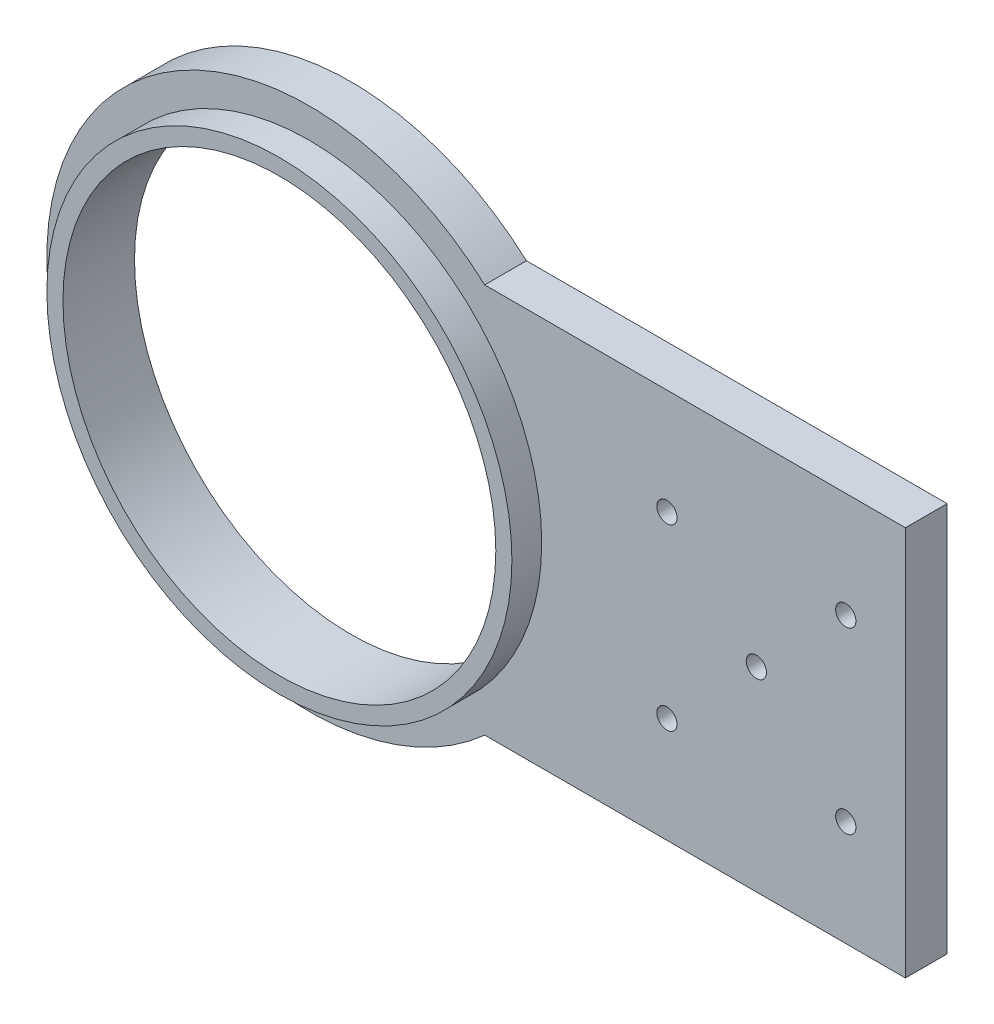
ISO-10303-21;
HEADER;
FILE_DESCRIPTION(('STEP AP214'),'2;1');
FILE_NAME('part.step','',(''),(''),'','','');
FILE_SCHEMA(('AUTOMOTIVE_DESIGN { 1 0 10303 214 1 1 1 1 }'));
ENDSEC;
DATA;
#1=APPLICATION_CONTEXT('core data for automotive mechanical design processes');
#2=APPLICATION_PROTOCOL_DEFINITION('international standard','automotive_design',2000,#1);
#3=PRODUCT_CONTEXT('',#1,'mechanical');
#4=PRODUCT('Part','Part','',(#3));
#5=PRODUCT_RELATED_PRODUCT_CATEGORY('part','',(#4));
#6=PRODUCT_DEFINITION_FORMATION('','',#4);
#7=PRODUCT_DEFINITION_CONTEXT('part definition',#1,'design');
#8=PRODUCT_DEFINITION('design','',#6,#7);
#9=PRODUCT_DEFINITION_SHAPE('','',#8);
#10=(LENGTH_UNIT() NAMED_UNIT(*) SI_UNIT(.MILLI.,.METRE.));
#11=(NAMED_UNIT(*) PLANE_ANGLE_UNIT() SI_UNIT($,.RADIAN.));
#12=(NAMED_UNIT(*) SI_UNIT($,.STERADIAN.) SOLID_ANGLE_UNIT());
#13=UNCERTAINTY_MEASURE_WITH_UNIT(LENGTH_MEASURE(1.E-05),#10,'distance_accuracy_value','');
#14=(GEOMETRIC_REPRESENTATION_CONTEXT(3) GLOBAL_UNCERTAINTY_ASSIGNED_CONTEXT((#13)) GLOBAL_UNIT_ASSIGNED_CONTEXT((#10,
#11,#12)) REPRESENTATION_CONTEXT('',''));
#15=CARTESIAN_POINT('',(0.,0.,0.));
#16=DIRECTION('',(0.,0.,1.));
#17=DIRECTION('',(1.,0.,0.));
#18=AXIS2_PLACEMENT_3D('',#15,#16,#17);
#19=CARTESIAN_POINT('',(0.,0.,2.5));
#20=DIRECTION('',(0.,0.,1.));
#21=DIRECTION('',(1.,0.,0.));
#22=AXIS2_PLACEMENT_3D('',#19,#20,#21);
#23=PLANE('',#22);
#24=CARTESIAN_POINT('',(0.,0.,2.5));
#25=DIRECTION('',(0.,0.,1.));
#26=DIRECTION('',(1.,0.,0.));
#27=AXIS2_PLACEMENT_3D('',#24,#25,#26);
#28=CIRCLE('',#27,39.);
#29=CARTESIAN_POINT('',(39.,0.,2.5));
#30=VERTEX_POINT('',#29);
#31=EDGE_CURVE('E11',#30,#30,#28,.T.);
#32=ORIENTED_EDGE('',*,*,#31,.T.);
#33=EDGE_LOOP('',(#32));
#34=FACE_BOUND('',#33,.T.);
#35=CARTESIAN_POINT('',(0.,0.,2.5));
#36=DIRECTION('',(0.,0.,1.));
#37=DIRECTION('',(1.,0.,0.));
#38=AXIS2_PLACEMENT_3D('',#35,#36,#37);
#39=CIRCLE('',#38,36.3);
#40=CARTESIAN_POINT('',(36.3,0.,2.5));
#41=VERTEX_POINT('',#40);
#42=EDGE_CURVE('E43',#41,#41,#39,.T.);
#43=ORIENTED_EDGE('',*,*,#42,.F.);
#44=EDGE_LOOP('',(#43));
#45=FACE_BOUND('',#44,.T.);
#46=ADVANCED_FACE('F34',(#34,#45),#23,.T.);
#47=CARTESIAN_POINT('',(0.,0.,2.5));
#48=DIRECTION('',(0.,0.,-1.));
#49=DIRECTION('',(-1.,0.,0.));
#50=AXIS2_PLACEMENT_3D('',#47,#48,#49);
#51=CYLINDRICAL_SURFACE('',#50,39.);
#52=ORIENTED_EDGE('',*,*,#31,.F.);
#53=EDGE_LOOP('',(#52));
#54=FACE_BOUND('',#53,.T.);
#55=CARTESIAN_POINT('',(0.,0.,-2.5));
#56=DIRECTION('',(0.,0.,1.));
#57=DIRECTION('',(1.,0.,0.));
#58=AXIS2_PLACEMENT_3D('',#55,#56,#57);
#59=CIRCLE('',#58,39.);
#60=CARTESIAN_POINT('',(39.,0.,-2.5));
#61=VERTEX_POINT('',#60);
#62=EDGE_CURVE('E38',#61,#61,#59,.T.);
#63=ORIENTED_EDGE('',*,*,#62,.T.);
#64=EDGE_LOOP('',(#63));
#65=FACE_BOUND('',#64,.T.);
#66=ADVANCED_FACE('F36',(#54,#65),#51,.T.);
#67=CARTESIAN_POINT('',(0.,0.,2.5));
#68=DIRECTION('',(0.,0.,-1.));
#69=DIRECTION('',(-1.,0.,0.));
#70=AXIS2_PLACEMENT_3D('',#67,#68,#69);
#71=CYLINDRICAL_SURFACE('',#70,36.3);
#72=ORIENTED_EDGE('',*,*,#42,.T.);
#73=EDGE_LOOP('',(#72));
#74=FACE_BOUND('',#73,.T.);
#75=CARTESIAN_POINT('',(0.,0.,-9.5));
#76=DIRECTION('',(0.,0.,-1.));
#77=DIRECTION('',(-1.,0.,0.));
#78=AXIS2_PLACEMENT_3D('',#75,#76,#77);
#79=CIRCLE('',#78,36.3);
#80=CARTESIAN_POINT('',(-36.3,0.,-9.5));
#81=VERTEX_POINT('',#80);
#82=EDGE_CURVE('E101',#81,#81,#79,.T.);
#83=ORIENTED_EDGE('',*,*,#82,.T.);
#84=EDGE_LOOP('',(#83));
#85=FACE_BOUND('',#84,.T.);
#86=ADVANCED_FACE('F124',(#74,#85),#71,.F.);
#87=CARTESIAN_POINT('',(0.,0.,-9.5));
#88=DIRECTION('',(0.,0.,-1.));
#89=DIRECTION('',(-1.,0.,0.));
#90=AXIS2_PLACEMENT_3D('',#87,#88,#89);
#91=PLANE('',#90);
#92=CARTESIAN_POINT('',(75.,0.,-9.5));
#93=DIRECTION('',(0.,0.,-1.));
#94=DIRECTION('',(-1.,0.,0.));
#95=AXIS2_PLACEMENT_3D('',#92,#93,#94);
#96=CIRCLE('',#95,3.5);
#97=CARTESIAN_POINT('',(71.5,0.,-9.5));
#98=VERTEX_POINT('',#97);
#99=EDGE_CURVE('E395',#98,#98,#96,.T.);
#100=ORIENTED_EDGE('',*,*,#99,.F.);
#101=EDGE_LOOP('',(#100));
#102=FACE_BOUND('',#101,.T.);
#103=CARTESIAN_POINT('',(90.,15.,-9.5));
#104=DIRECTION('',(0.,0.,-1.));
#105=DIRECTION('',(-1.,0.,0.));
#106=AXIS2_PLACEMENT_3D('',#103,#104,#105);
#107=CIRCLE('',#106,3.49999999999999);
#108=CARTESIAN_POINT('',(86.5,15.,-9.5));
#109=VERTEX_POINT('',#108);
#110=EDGE_CURVE('E384',#109,#109,#107,.T.);
#111=ORIENTED_EDGE('',*,*,#110,.F.);
#112=EDGE_LOOP('',(#111));
#113=FACE_BOUND('',#112,.T.);
#114=CARTESIAN_POINT('',(60.,-15.,-9.5));
#115=DIRECTION('',(0.,0.,-1.));
#116=DIRECTION('',(-1.,0.,0.));
#117=AXIS2_PLACEMENT_3D('',#114,#115,#116);
#118=CIRCLE('',#117,3.49999999999999);
#119=CARTESIAN_POINT('',(56.5,-15.,-9.5));
#120=VERTEX_POINT('',#119);
#121=EDGE_CURVE('E372',#120,#120,#118,.T.);
#122=ORIENTED_EDGE('',*,*,#121,.F.);
#123=EDGE_LOOP('',(#122));
#124=FACE_BOUND('',#123,.T.);
#125=CARTESIAN_POINT('',(60.,15.,-9.5));
#126=DIRECTION('',(0.,0.,-1.));
#127=DIRECTION('',(-1.,0.,0.));
#128=AXIS2_PLACEMENT_3D('',#125,#126,#127);
#129=CIRCLE('',#128,3.49999999999999);
#130=CARTESIAN_POINT('',(56.5,15.,-9.5));
#131=VERTEX_POINT('',#130);
#132=EDGE_CURVE('E360',#131,#131,#129,.T.);
#133=ORIENTED_EDGE('',*,*,#132,.F.);
#134=EDGE_LOOP('',(#133));
#135=FACE_BOUND('',#134,.T.);
#136=CARTESIAN_POINT('',(90.,-15.,-9.5));
#137=DIRECTION('',(0.,0.,-1.));
#138=DIRECTION('',(-1.,0.,0.));
#139=AXIS2_PLACEMENT_3D('',#136,#137,#138);
#140=CIRCLE('',#139,3.49999999999999);
#141=CARTESIAN_POINT('',(86.5,-15.,-9.5));
#142=VERTEX_POINT('',#141);
#143=EDGE_CURVE('E348',#142,#142,#140,.T.);
#144=ORIENTED_EDGE('',*,*,#143,.F.);
#145=EDGE_LOOP('',(#144));
#146=FACE_BOUND('',#145,.T.);
#147=CARTESIAN_POINT('',(0.,0.,-9.5));
#148=DIRECTION('',(0.,0.,-1.));
#149=DIRECTION('',(-1.,0.,0.));
#150=AXIS2_PLACEMENT_3D('',#147,#148,#149);
#151=CIRCLE('',#150,44.);
#152=CARTESIAN_POINT('',(29.4399388586322,-32.7,-9.5));
#153=VERTEX_POINT('',#152);
#154=CARTESIAN_POINT('',(29.4399388586322,32.7,-9.5));
#155=VERTEX_POINT('',#154);
#156=EDGE_CURVE('E96',#153,#155,#151,.T.);
#157=ORIENTED_EDGE('',*,*,#156,.T.);
#158=DIRECTION('',(1.,0.,0.));
#159=VECTOR('',#158,1.);
#160=CARTESIAN_POINT('',(0.,32.7,-9.5));
#161=LINE('',#160,#159);
#162=CARTESIAN_POINT('',(100.,32.7,-9.5));
#163=VERTEX_POINT('',#162);
#164=EDGE_CURVE('E331',#155,#163,#161,.T.);
#165=ORIENTED_EDGE('',*,*,#164,.T.);
#166=DIRECTION('',(0.,-1.,0.));
#167=VECTOR('',#166,1.);
#168=CARTESIAN_POINT('',(100.,0.,-9.5));
#169=LINE('',#168,#167);
#170=CARTESIAN_POINT('',(100.,-32.7,-9.5));
#171=VERTEX_POINT('',#170);
#172=EDGE_CURVE('E327',#163,#171,#169,.T.);
#173=ORIENTED_EDGE('',*,*,#172,.T.);
#174=DIRECTION('',(-1.,0.,0.));
#175=VECTOR('',#174,1.);
#176=CARTESIAN_POINT('',(0.,-32.7,-9.5));
#177=LINE('',#176,#175);
#178=EDGE_CURVE('E50',#171,#153,#177,.T.);
#179=ORIENTED_EDGE('',*,*,#178,.T.);
#180=EDGE_LOOP('',(#157,#165,#173,#179));
#181=FACE_BOUND('',#180,.T.);
#182=ORIENTED_EDGE('',*,*,#82,.F.);
#183=EDGE_LOOP('',(#182));
#184=FACE_BOUND('',#183,.T.);
#185=ADVANCED_FACE('F115',(#102,#113,#124,#135,#146,#181,#184),#91,.T.);
#186=CARTESIAN_POINT('',(0.,0.,-2.5));
#187=DIRECTION('',(0.,0.,-1.));
#188=DIRECTION('',(-1.,0.,0.));
#189=AXIS2_PLACEMENT_3D('',#186,#187,#188);
#190=PLANE('',#189);
#191=CARTESIAN_POINT('',(75.,0.,-2.5));
#192=DIRECTION('',(0.,0.,-1.));
#193=DIRECTION('',(-1.,0.,0.));
#194=AXIS2_PLACEMENT_3D('',#191,#192,#193);
#195=CIRCLE('',#194,1.7);
#196=CARTESIAN_POINT('',(73.3,0.,-2.5));
#197=VERTEX_POINT('',#196);
#198=EDGE_CURVE('E387',#197,#197,#195,.T.);
#199=ORIENTED_EDGE('',*,*,#198,.T.);
#200=EDGE_LOOP('',(#199));
#201=FACE_BOUND('',#200,.T.);
#202=CARTESIAN_POINT('',(90.,15.,-2.5));
#203=DIRECTION('',(0.,0.,-1.));
#204=DIRECTION('',(-1.,0.,0.));
#205=AXIS2_PLACEMENT_3D('',#202,#203,#204);
#206=CIRCLE('',#205,1.7);
#207=CARTESIAN_POINT('',(88.3,15.,-2.5));
#208=VERTEX_POINT('',#207);
#209=EDGE_CURVE('E375',#208,#208,#206,.T.);
#210=ORIENTED_EDGE('',*,*,#209,.T.);
#211=EDGE_LOOP('',(#210));
#212=FACE_BOUND('',#211,.T.);
#213=CARTESIAN_POINT('',(60.,-15.,-2.5));
#214=DIRECTION('',(0.,0.,-1.));
#215=DIRECTION('',(-1.,0.,0.));
#216=AXIS2_PLACEMENT_3D('',#213,#214,#215);
#217=CIRCLE('',#216,1.70000000000001);
#218=CARTESIAN_POINT('',(58.3,-15.,-2.5));
#219=VERTEX_POINT('',#218);
#220=EDGE_CURVE('E363',#219,#219,#217,.T.);
#221=ORIENTED_EDGE('',*,*,#220,.T.);
#222=EDGE_LOOP('',(#221));
#223=FACE_BOUND('',#222,.T.);
#224=CARTESIAN_POINT('',(60.,15.,-2.5));
#225=DIRECTION('',(0.,0.,-1.));
#226=DIRECTION('',(-1.,0.,0.));
#227=AXIS2_PLACEMENT_3D('',#224,#225,#226);
#228=CIRCLE('',#227,1.70000000000001);
#229=CARTESIAN_POINT('',(58.3,15.,-2.5));
#230=VERTEX_POINT('',#229);
#231=EDGE_CURVE('E351',#230,#230,#228,.T.);
#232=ORIENTED_EDGE('',*,*,#231,.T.);
#233=EDGE_LOOP('',(#232));
#234=FACE_BOUND('',#233,.T.);
#235=CARTESIAN_POINT('',(90.,-15.,-2.5));
#236=DIRECTION('',(0.,0.,-1.));
#237=DIRECTION('',(-1.,0.,0.));
#238=AXIS2_PLACEMENT_3D('',#235,#236,#237);
#239=CIRCLE('',#238,1.7);
#240=CARTESIAN_POINT('',(88.3,-15.,-2.5));
#241=VERTEX_POINT('',#240);
#242=EDGE_CURVE('E329',#241,#241,#239,.T.);
#243=ORIENTED_EDGE('',*,*,#242,.T.);
#244=EDGE_LOOP('',(#243));
#245=FACE_BOUND('',#244,.T.);
#246=ORIENTED_EDGE('',*,*,#62,.F.);
#247=EDGE_LOOP('',(#246));
#248=FACE_BOUND('',#247,.T.);
#249=CARTESIAN_POINT('',(0.,0.,-2.5));
#250=DIRECTION('',(0.,0.,-1.));
#251=DIRECTION('',(-1.,0.,0.));
#252=AXIS2_PLACEMENT_3D('',#249,#250,#251);
#253=CIRCLE('',#252,44.);
#254=CARTESIAN_POINT('',(29.4399388586322,-32.7,-2.5));
#255=VERTEX_POINT('',#254);
#256=CARTESIAN_POINT('',(29.4399388586322,32.7,-2.5));
#257=VERTEX_POINT('',#256);
#258=EDGE_CURVE('E95',#255,#257,#253,.T.);
#259=ORIENTED_EDGE('',*,*,#258,.F.);
#260=DIRECTION('',(-1.,0.,0.));
#261=VECTOR('',#260,1.);
#262=CARTESIAN_POINT('',(0.,-32.7,-2.5));
#263=LINE('',#262,#261);
#264=CARTESIAN_POINT('',(100.,-32.7,-2.5));
#265=VERTEX_POINT('',#264);
#266=EDGE_CURVE('E81',#265,#255,#263,.T.);
#267=ORIENTED_EDGE('',*,*,#266,.F.);
#268=DIRECTION('',(0.,-1.,0.));
#269=VECTOR('',#268,1.);
#270=CARTESIAN_POINT('',(100.,0.,-2.5));
#271=LINE('',#270,#269);
#272=CARTESIAN_POINT('',(100.,32.7,-2.5));
#273=VERTEX_POINT('',#272);
#274=EDGE_CURVE('E89',#273,#265,#271,.T.);
#275=ORIENTED_EDGE('',*,*,#274,.F.);
#276=DIRECTION('',(1.,0.,0.));
#277=VECTOR('',#276,1.);
#278=CARTESIAN_POINT('',(0.,32.7,-2.5));
#279=LINE('',#278,#277);
#280=EDGE_CURVE('E88',#257,#273,#279,.T.);
#281=ORIENTED_EDGE('',*,*,#280,.F.);
#282=EDGE_LOOP('',(#259,#267,#275,#281));
#283=FACE_BOUND('',#282,.T.);
#284=ADVANCED_FACE('F100',(#201,#212,#223,#234,#245,#248,#283),#190,.F.);
#285=CARTESIAN_POINT('',(0.,0.,-9.5));
#286=DIRECTION('',(0.,0.,1.));
#287=DIRECTION('',(1.,0.,0.));
#288=AXIS2_PLACEMENT_3D('',#285,#286,#287);
#289=CYLINDRICAL_SURFACE('',#288,44.);
#290=ORIENTED_EDGE('',*,*,#258,.T.);
#291=DIRECTION('',(0.,0.,-1.));
#292=VECTOR('',#291,1.);
#293=CARTESIAN_POINT('',(29.4399388586322,32.7,-2.5));
#294=LINE('',#293,#292);
#295=EDGE_CURVE('E97',#257,#155,#294,.T.);
#296=ORIENTED_EDGE('',*,*,#295,.T.);
#297=ORIENTED_EDGE('',*,*,#156,.F.);
#298=DIRECTION('',(0.,0.,-1.));
#299=VECTOR('',#298,1.);
#300=CARTESIAN_POINT('',(29.4399388586322,-32.7,-2.5));
#301=LINE('',#300,#299);
#302=EDGE_CURVE('E84',#255,#153,#301,.T.);
#303=ORIENTED_EDGE('',*,*,#302,.F.);
#304=EDGE_LOOP('',(#290,#296,#297,#303));
#305=FACE_BOUND('',#304,.T.);
#306=ADVANCED_FACE('F93',(#305),#289,.T.);
#307=CARTESIAN_POINT('',(100.,0.,-2.5));
#308=DIRECTION('',(1.,0.,0.));
#309=DIRECTION('',(0.,0.,-1.));
#310=AXIS2_PLACEMENT_3D('',#307,#308,#309);
#311=PLANE('',#310);
#312=ORIENTED_EDGE('',*,*,#172,.F.);
#313=DIRECTION('',(0.,0.,-1.));
#314=VECTOR('',#313,1.);
#315=CARTESIAN_POINT('',(100.,32.7,-2.5));
#316=LINE('',#315,#314);
#317=EDGE_CURVE('E59',#273,#163,#316,.T.);
#318=ORIENTED_EDGE('',*,*,#317,.F.);
#319=ORIENTED_EDGE('',*,*,#274,.T.);
#320=DIRECTION('',(0.,0.,-1.));
#321=VECTOR('',#320,1.);
#322=CARTESIAN_POINT('',(100.,-32.7,-2.5));
#323=LINE('',#322,#321);
#324=EDGE_CURVE('E79',#265,#171,#323,.T.);
#325=ORIENTED_EDGE('',*,*,#324,.T.);
#326=EDGE_LOOP('',(#312,#318,#319,#325));
#327=FACE_BOUND('',#326,.T.);
#328=ADVANCED_FACE('F122',(#327),#311,.T.);
#329=CARTESIAN_POINT('',(0.,32.7,-2.5));
#330=DIRECTION('',(0.,1.,0.));
#331=DIRECTION('',(0.,0.,1.));
#332=AXIS2_PLACEMENT_3D('',#329,#330,#331);
#333=PLANE('',#332);
#334=ORIENTED_EDGE('',*,*,#164,.F.);
#335=ORIENTED_EDGE('',*,*,#295,.F.);
#336=ORIENTED_EDGE('',*,*,#280,.T.);
#337=ORIENTED_EDGE('',*,*,#317,.T.);
#338=EDGE_LOOP('',(#334,#335,#336,#337));
#339=FACE_BOUND('',#338,.T.);
#340=ADVANCED_FACE('F320',(#339),#333,.T.);
#341=CARTESIAN_POINT('',(0.,-32.7,-2.5));
#342=DIRECTION('',(0.,-1.,0.));
#343=DIRECTION('',(0.,0.,-1.));
#344=AXIS2_PLACEMENT_3D('',#341,#342,#343);
#345=PLANE('',#344);
#346=ORIENTED_EDGE('',*,*,#178,.F.);
#347=ORIENTED_EDGE('',*,*,#324,.F.);
#348=ORIENTED_EDGE('',*,*,#266,.T.);
#349=ORIENTED_EDGE('',*,*,#302,.T.);
#350=EDGE_LOOP('',(#346,#347,#348,#349));
#351=FACE_BOUND('',#350,.T.);
#352=ADVANCED_FACE('F83',(#351),#345,.T.);
#353=CARTESIAN_POINT('',(90.,-15.,-9.5));
#354=DIRECTION('',(0.,0.,-1.));
#355=DIRECTION('',(-1.,0.,0.));
#356=AXIS2_PLACEMENT_3D('',#353,#354,#355);
#357=CYLINDRICAL_SURFACE('',#356,1.7);
#358=ORIENTED_EDGE('',*,*,#242,.F.);
#359=EDGE_LOOP('',(#358));
#360=FACE_BOUND('',#359,.T.);
#361=CARTESIAN_POINT('',(90.,-15.,-7.1));
#362=DIRECTION('',(0.,0.,-1.));
#363=DIRECTION('',(-1.,0.,0.));
#364=AXIS2_PLACEMENT_3D('',#361,#362,#363);
#365=CIRCLE('',#364,1.70000000000001);
#366=CARTESIAN_POINT('',(88.3,-15.,-7.1));
#367=VERTEX_POINT('',#366);
#368=EDGE_CURVE('E342',#367,#367,#365,.T.);
#369=ORIENTED_EDGE('',*,*,#368,.T.);
#370=EDGE_LOOP('',(#369));
#371=FACE_BOUND('',#370,.T.);
#372=ADVANCED_FACE('F168',(#360,#371),#357,.F.);
#373=CARTESIAN_POINT('',(91.7,-15.,-7.1));
#374=DIRECTION('',(0.,0.,1.));
#375=DIRECTION('',(1.,0.,0.));
#376=AXIS2_PLACEMENT_3D('',#373,#374,#375);
#377=PLANE('',#376);
#378=ORIENTED_EDGE('',*,*,#368,.F.);
#379=EDGE_LOOP('',(#378));
#380=FACE_BOUND('',#379,.T.);
#381=CARTESIAN_POINT('',(90.,-15.,-7.1));
#382=DIRECTION('',(0.,0.,-1.));
#383=DIRECTION('',(-1.,0.,0.));
#384=AXIS2_PLACEMENT_3D('',#381,#382,#383);
#385=CIRCLE('',#384,3.49999999999999);
#386=CARTESIAN_POINT('',(86.5,-15.,-7.1));
#387=VERTEX_POINT('',#386);
#388=EDGE_CURVE('E345',#387,#387,#385,.T.);
#389=ORIENTED_EDGE('',*,*,#388,.T.);
#390=EDGE_LOOP('',(#389));
#391=FACE_BOUND('',#390,.T.);
#392=ADVANCED_FACE('F173',(#380,#391),#377,.F.);
#393=CARTESIAN_POINT('',(90.,-15.,-9.5));
#394=DIRECTION('',(0.,0.,-1.));
#395=DIRECTION('',(-1.,0.,0.));
#396=AXIS2_PLACEMENT_3D('',#393,#394,#395);
#397=CYLINDRICAL_SURFACE('',#396,3.49999999999999);
#398=ORIENTED_EDGE('',*,*,#388,.F.);
#399=EDGE_LOOP('',(#398));
#400=FACE_BOUND('',#399,.T.);
#401=ORIENTED_EDGE('',*,*,#143,.T.);
#402=EDGE_LOOP('',(#401));
#403=FACE_BOUND('',#402,.T.);
#404=ADVANCED_FACE('F183',(#400,#403),#397,.F.);
#405=CARTESIAN_POINT('',(60.,15.,-9.5));
#406=DIRECTION('',(0.,0.,-1.));
#407=DIRECTION('',(-1.,0.,0.));
#408=AXIS2_PLACEMENT_3D('',#405,#406,#407);
#409=CYLINDRICAL_SURFACE('',#408,1.70000000000001);
#410=ORIENTED_EDGE('',*,*,#231,.F.);
#411=EDGE_LOOP('',(#410));
#412=FACE_BOUND('',#411,.T.);
#413=CARTESIAN_POINT('',(60.,15.,-7.1));
#414=DIRECTION('',(0.,0.,-1.));
#415=DIRECTION('',(-1.,0.,0.));
#416=AXIS2_PLACEMENT_3D('',#413,#414,#415);
#417=CIRCLE('',#416,1.70000000000001);
#418=CARTESIAN_POINT('',(58.3,15.,-7.1));
#419=VERTEX_POINT('',#418);
#420=EDGE_CURVE('E354',#419,#419,#417,.T.);
#421=ORIENTED_EDGE('',*,*,#420,.T.);
#422=EDGE_LOOP('',(#421));
#423=FACE_BOUND('',#422,.T.);
#424=ADVANCED_FACE('F193',(#412,#423),#409,.F.);
#425=CARTESIAN_POINT('',(61.7,15.,-7.1));
#426=DIRECTION('',(0.,0.,1.));
#427=DIRECTION('',(1.,0.,0.));
#428=AXIS2_PLACEMENT_3D('',#425,#426,#427);
#429=PLANE('',#428);
#430=ORIENTED_EDGE('',*,*,#420,.F.);
#431=EDGE_LOOP('',(#430));
#432=FACE_BOUND('',#431,.T.);
#433=CARTESIAN_POINT('',(60.,15.,-7.1));
#434=DIRECTION('',(0.,0.,-1.));
#435=DIRECTION('',(-1.,0.,0.));
#436=AXIS2_PLACEMENT_3D('',#433,#434,#435);
#437=CIRCLE('',#436,3.49999999999999);
#438=CARTESIAN_POINT('',(56.5,15.,-7.1));
#439=VERTEX_POINT('',#438);
#440=EDGE_CURVE('E357',#439,#439,#437,.T.);
#441=ORIENTED_EDGE('',*,*,#440,.T.);
#442=EDGE_LOOP('',(#441));
#443=FACE_BOUND('',#442,.T.);
#444=ADVANCED_FACE('F203',(#432,#443),#429,.F.);
#445=CARTESIAN_POINT('',(60.,15.,-9.5));
#446=DIRECTION('',(0.,0.,-1.));
#447=DIRECTION('',(-1.,0.,0.));
#448=AXIS2_PLACEMENT_3D('',#445,#446,#447);
#449=CYLINDRICAL_SURFACE('',#448,3.49999999999999);
#450=ORIENTED_EDGE('',*,*,#440,.F.);
#451=EDGE_LOOP('',(#450));
#452=FACE_BOUND('',#451,.T.);
#453=ORIENTED_EDGE('',*,*,#132,.T.);
#454=EDGE_LOOP('',(#453));
#455=FACE_BOUND('',#454,.T.);
#456=ADVANCED_FACE('F213',(#452,#455),#449,.F.);
#457=CARTESIAN_POINT('',(60.,-15.,-9.5));
#458=DIRECTION('',(0.,0.,-1.));
#459=DIRECTION('',(-1.,0.,0.));
#460=AXIS2_PLACEMENT_3D('',#457,#458,#459);
#461=CYLINDRICAL_SURFACE('',#460,1.70000000000001);
#462=ORIENTED_EDGE('',*,*,#220,.F.);
#463=EDGE_LOOP('',(#462));
#464=FACE_BOUND('',#463,.T.);
#465=CARTESIAN_POINT('',(60.,-15.,-7.1));
#466=DIRECTION('',(0.,0.,-1.));
#467=DIRECTION('',(-1.,0.,0.));
#468=AXIS2_PLACEMENT_3D('',#465,#466,#467);
#469=CIRCLE('',#468,1.70000000000001);
#470=CARTESIAN_POINT('',(58.3,-15.,-7.1));
#471=VERTEX_POINT('',#470);
#472=EDGE_CURVE('E366',#471,#471,#469,.T.);
#473=ORIENTED_EDGE('',*,*,#472,.T.);
#474=EDGE_LOOP('',(#473));
#475=FACE_BOUND('',#474,.T.);
#476=ADVANCED_FACE('F223',(#464,#475),#461,.F.);
#477=CARTESIAN_POINT('',(61.7,-15.,-7.1));
#478=DIRECTION('',(0.,0.,1.));
#479=DIRECTION('',(1.,0.,0.));
#480=AXIS2_PLACEMENT_3D('',#477,#478,#479);
#481=PLANE('',#480);
#482=ORIENTED_EDGE('',*,*,#472,.F.);
#483=EDGE_LOOP('',(#482));
#484=FACE_BOUND('',#483,.T.);
#485=CARTESIAN_POINT('',(60.,-15.,-7.1));
#486=DIRECTION('',(0.,0.,-1.));
#487=DIRECTION('',(-1.,0.,0.));
#488=AXIS2_PLACEMENT_3D('',#485,#486,#487);
#489=CIRCLE('',#488,3.49999999999999);
#490=CARTESIAN_POINT('',(56.5,-15.,-7.1));
#491=VERTEX_POINT('',#490);
#492=EDGE_CURVE('E369',#491,#491,#489,.T.);
#493=ORIENTED_EDGE('',*,*,#492,.T.);
#494=EDGE_LOOP('',(#493));
#495=FACE_BOUND('',#494,.T.);
#496=ADVANCED_FACE('F233',(#484,#495),#481,.F.);
#497=CARTESIAN_POINT('',(60.,-15.,-9.5));
#498=DIRECTION('',(0.,0.,-1.));
#499=DIRECTION('',(-1.,0.,0.));
#500=AXIS2_PLACEMENT_3D('',#497,#498,#499);
#501=CYLINDRICAL_SURFACE('',#500,3.49999999999999);
#502=ORIENTED_EDGE('',*,*,#492,.F.);
#503=EDGE_LOOP('',(#502));
#504=FACE_BOUND('',#503,.T.);
#505=ORIENTED_EDGE('',*,*,#121,.T.);
#506=EDGE_LOOP('',(#505));
#507=FACE_BOUND('',#506,.T.);
#508=ADVANCED_FACE('F243',(#504,#507),#501,.F.);
#509=CARTESIAN_POINT('',(90.,15.,-9.5));
#510=DIRECTION('',(0.,0.,-1.));
#511=DIRECTION('',(-1.,0.,0.));
#512=AXIS2_PLACEMENT_3D('',#509,#510,#511);
#513=CYLINDRICAL_SURFACE('',#512,1.7);
#514=ORIENTED_EDGE('',*,*,#209,.F.);
#515=EDGE_LOOP('',(#514));
#516=FACE_BOUND('',#515,.T.);
#517=CARTESIAN_POINT('',(90.,15.,-7.1));
#518=DIRECTION('',(0.,0.,-1.));
#519=DIRECTION('',(-1.,0.,0.));
#520=AXIS2_PLACEMENT_3D('',#517,#518,#519);
#521=CIRCLE('',#520,1.70000000000001);
#522=CARTESIAN_POINT('',(88.3,15.,-7.1));
#523=VERTEX_POINT('',#522);
#524=EDGE_CURVE('E378',#523,#523,#521,.T.);
#525=ORIENTED_EDGE('',*,*,#524,.T.);
#526=EDGE_LOOP('',(#525));
#527=FACE_BOUND('',#526,.T.);
#528=ADVANCED_FACE('F253',(#516,#527),#513,.F.);
#529=CARTESIAN_POINT('',(91.7,15.,-7.1));
#530=DIRECTION('',(0.,0.,1.));
#531=DIRECTION('',(1.,0.,0.));
#532=AXIS2_PLACEMENT_3D('',#529,#530,#531);
#533=PLANE('',#532);
#534=ORIENTED_EDGE('',*,*,#524,.F.);
#535=EDGE_LOOP('',(#534));
#536=FACE_BOUND('',#535,.T.);
#537=CARTESIAN_POINT('',(90.,15.,-7.1));
#538=DIRECTION('',(0.,0.,-1.));
#539=DIRECTION('',(-1.,0.,0.));
#540=AXIS2_PLACEMENT_3D('',#537,#538,#539);
#541=CIRCLE('',#540,3.49999999999999);
#542=CARTESIAN_POINT('',(86.5,15.,-7.1));
#543=VERTEX_POINT('',#542);
#544=EDGE_CURVE('E381',#543,#543,#541,.T.);
#545=ORIENTED_EDGE('',*,*,#544,.T.);
#546=EDGE_LOOP('',(#545));
#547=FACE_BOUND('',#546,.T.);
#548=ADVANCED_FACE('F263',(#536,#547),#533,.F.);
#549=CARTESIAN_POINT('',(90.,15.,-9.5));
#550=DIRECTION('',(0.,0.,-1.));
#551=DIRECTION('',(-1.,0.,0.));
#552=AXIS2_PLACEMENT_3D('',#549,#550,#551);
#553=CYLINDRICAL_SURFACE('',#552,3.49999999999999);
#554=ORIENTED_EDGE('',*,*,#544,.F.);
#555=EDGE_LOOP('',(#554));
#556=FACE_BOUND('',#555,.T.);
#557=ORIENTED_EDGE('',*,*,#110,.T.);
#558=EDGE_LOOP('',(#557));
#559=FACE_BOUND('',#558,.T.);
#560=ADVANCED_FACE('F273',(#556,#559),#553,.F.);
#561=CARTESIAN_POINT('',(75.,0.,-9.5));
#562=DIRECTION('',(0.,0.,-1.));
#563=DIRECTION('',(-1.,0.,0.));
#564=AXIS2_PLACEMENT_3D('',#561,#562,#563);
#565=CYLINDRICAL_SURFACE('',#564,1.7);
#566=ORIENTED_EDGE('',*,*,#198,.F.);
#567=EDGE_LOOP('',(#566));
#568=FACE_BOUND('',#567,.T.);
#569=CARTESIAN_POINT('',(75.,0.,-7.1));
#570=DIRECTION('',(0.,0.,-1.));
#571=DIRECTION('',(-1.,0.,0.));
#572=AXIS2_PLACEMENT_3D('',#569,#570,#571);
#573=CIRCLE('',#572,1.70000000000001);
#574=CARTESIAN_POINT('',(73.3,0.,-7.1));
#575=VERTEX_POINT('',#574);
#576=EDGE_CURVE('E389',#575,#575,#573,.T.);
#577=ORIENTED_EDGE('',*,*,#576,.T.);
#578=EDGE_LOOP('',(#577));
#579=FACE_BOUND('',#578,.T.);
#580=ADVANCED_FACE('F283',(#568,#579),#565,.F.);
#581=CARTESIAN_POINT('',(76.7,0.,-7.1));
#582=DIRECTION('',(0.,0.,1.));
#583=DIRECTION('',(1.,0.,0.));
#584=AXIS2_PLACEMENT_3D('',#581,#582,#583);
#585=PLANE('',#584);
#586=ORIENTED_EDGE('',*,*,#576,.F.);
#587=EDGE_LOOP('',(#586));
#588=FACE_BOUND('',#587,.T.);
#589=CARTESIAN_POINT('',(75.,0.,-7.1));
#590=DIRECTION('',(0.,0.,-1.));
#591=DIRECTION('',(-1.,0.,0.));
#592=AXIS2_PLACEMENT_3D('',#589,#590,#591);
#593=CIRCLE('',#592,3.5);
#594=CARTESIAN_POINT('',(71.5,0.,-7.1));
#595=VERTEX_POINT('',#594);
#596=EDGE_CURVE('E392',#595,#595,#593,.T.);
#597=ORIENTED_EDGE('',*,*,#596,.T.);
#598=EDGE_LOOP('',(#597));
#599=FACE_BOUND('',#598,.T.);
#600=ADVANCED_FACE('F293',(#588,#599),#585,.F.);
#601=CARTESIAN_POINT('',(75.,0.,-9.5));
#602=DIRECTION('',(0.,0.,-1.));
#603=DIRECTION('',(-1.,0.,0.));
#604=AXIS2_PLACEMENT_3D('',#601,#602,#603);
#605=CYLINDRICAL_SURFACE('',#604,3.5);
#606=ORIENTED_EDGE('',*,*,#596,.F.);
#607=EDGE_LOOP('',(#606));
#608=FACE_BOUND('',#607,.T.);
#609=ORIENTED_EDGE('',*,*,#99,.T.);
#610=EDGE_LOOP('',(#609));
#611=FACE_BOUND('',#610,.T.);
#612=ADVANCED_FACE('F303',(#608,#611),#605,.F.);
#613=CLOSED_SHELL('',(#46,#66,#86,#185,#284,#306,#328,#340,#352,#372,#392,#404,#424,#444,#456,
#476,#496,#508,#528,#548,#560,#580,#600,#612));
#614=MANIFOLD_SOLID_BREP('B2',#613);
#615=ADVANCED_BREP_SHAPE_REPRESENTATION('',(#18,#614),#14);
#616=SHAPE_DEFINITION_REPRESENTATION(#9,#615);
ENDSEC;
END-ISO-10303-21;
